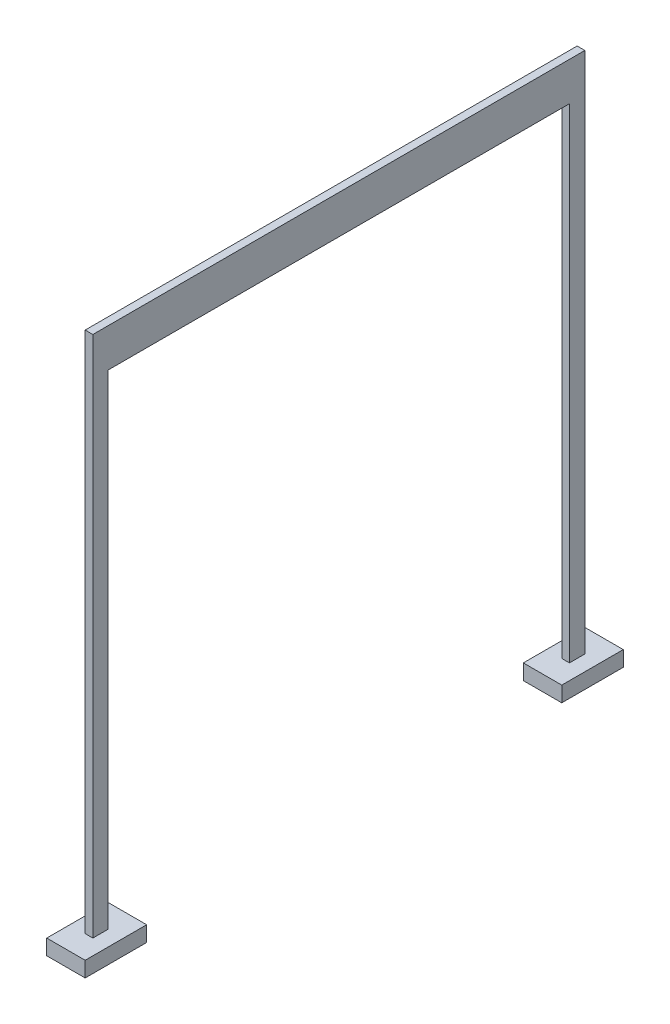
ISO-10303-21;
HEADER;
FILE_DESCRIPTION(('STEP AP214'),'2;1');
FILE_NAME('part.step','',(''),(''),'','','');
FILE_SCHEMA(('AUTOMOTIVE_DESIGN { 1 0 10303 214 1 1 1 1 }'));
ENDSEC;
DATA;
#1=APPLICATION_CONTEXT('core data for automotive mechanical design processes');
#2=APPLICATION_PROTOCOL_DEFINITION('international standard','automotive_design',2000,#1);
#3=PRODUCT_CONTEXT('',#1,'mechanical');
#4=PRODUCT('Part','Part','',(#3));
#5=PRODUCT_RELATED_PRODUCT_CATEGORY('part','',(#4));
#6=PRODUCT_DEFINITION_FORMATION('','',#4);
#7=PRODUCT_DEFINITION_CONTEXT('part definition',#1,'design');
#8=PRODUCT_DEFINITION('design','',#6,#7);
#9=PRODUCT_DEFINITION_SHAPE('','',#8);
#10=(LENGTH_UNIT() NAMED_UNIT(*) SI_UNIT(.MILLI.,.METRE.));
#11=(NAMED_UNIT(*) PLANE_ANGLE_UNIT() SI_UNIT($,.RADIAN.));
#12=(NAMED_UNIT(*) SI_UNIT($,.STERADIAN.) SOLID_ANGLE_UNIT());
#13=UNCERTAINTY_MEASURE_WITH_UNIT(LENGTH_MEASURE(1.E-05),#10,'distance_accuracy_value','');
#14=(GEOMETRIC_REPRESENTATION_CONTEXT(3) GLOBAL_UNCERTAINTY_ASSIGNED_CONTEXT((#13)) GLOBAL_UNIT_ASSIGNED_CONTEXT((#10,
#11,#12)) REPRESENTATION_CONTEXT('',''));
#15=CARTESIAN_POINT('',(0.,0.,0.));
#16=DIRECTION('',(0.,0.,1.));
#17=DIRECTION('',(1.,0.,0.));
#18=AXIS2_PLACEMENT_3D('',#15,#16,#17);
#19=CARTESIAN_POINT('',(5.,0.,0.));
#20=DIRECTION('',(1.,0.,0.));
#21=DIRECTION('',(0.,0.,-1.));
#22=AXIS2_PLACEMENT_3D('',#19,#20,#21);
#23=PLANE('',#22);
#24=DIRECTION('',(0.,1.,0.));
#25=VECTOR('',#24,1.);
#26=CARTESIAN_POINT('',(5.,0.,-300.));
#27=LINE('',#26,#25);
#28=CARTESIAN_POINT('',(5.,-654.999999999999,-300.));
#29=VERTEX_POINT('',#28);
#30=CARTESIAN_POINT('',(5.,-25.,-300.));
#31=VERTEX_POINT('',#30);
#32=EDGE_CURVE('E109',#29,#31,#27,.T.);
#33=ORIENTED_EDGE('',*,*,#32,.F.);
#34=DIRECTION('',(0.,0.,-1.));
#35=VECTOR('',#34,1.);
#36=CARTESIAN_POINT('',(5.,-654.999999999999,0.));
#37=LINE('',#36,#35);
#38=CARTESIAN_POINT('',(5.,-654.999999999999,-320.));
#39=VERTEX_POINT('',#38);
#40=EDGE_CURVE('E104',#29,#39,#37,.T.);
#41=ORIENTED_EDGE('',*,*,#40,.T.);
#42=DIRECTION('',(0.,-1.,0.));
#43=VECTOR('',#42,1.);
#44=CARTESIAN_POINT('',(5.,0.,-320.));
#45=LINE('',#44,#43);
#46=CARTESIAN_POINT('',(5.,25.,-320.));
#47=VERTEX_POINT('',#46);
#48=EDGE_CURVE('E107',#47,#39,#45,.T.);
#49=ORIENTED_EDGE('',*,*,#48,.F.);
#50=DIRECTION('',(0.,0.,1.));
#51=VECTOR('',#50,1.);
#52=CARTESIAN_POINT('',(5.,25.0000000000001,0.));
#53=LINE('',#52,#51);
#54=CARTESIAN_POINT('',(5.,25.,320.));
#55=VERTEX_POINT('',#54);
#56=EDGE_CURVE('E58',#47,#55,#53,.T.);
#57=ORIENTED_EDGE('',*,*,#56,.T.);
#58=DIRECTION('',(0.,-1.,0.));
#59=VECTOR('',#58,1.);
#60=CARTESIAN_POINT('',(5.,0.,320.));
#61=LINE('',#60,#59);
#62=CARTESIAN_POINT('',(5.,-655.,320.));
#63=VERTEX_POINT('',#62);
#64=EDGE_CURVE('E148',#55,#63,#61,.T.);
#65=ORIENTED_EDGE('',*,*,#64,.T.);
#66=DIRECTION('',(0.,0.,1.));
#67=VECTOR('',#66,1.);
#68=CARTESIAN_POINT('',(5.,-655.,0.));
#69=LINE('',#68,#67);
#70=CARTESIAN_POINT('',(5.,-655.,300.));
#71=VERTEX_POINT('',#70);
#72=EDGE_CURVE('E90',#71,#63,#69,.T.);
#73=ORIENTED_EDGE('',*,*,#72,.F.);
#74=DIRECTION('',(0.,-1.,0.));
#75=VECTOR('',#74,1.);
#76=CARTESIAN_POINT('',(5.,0.,300.));
#77=LINE('',#76,#75);
#78=CARTESIAN_POINT('',(5.,-25.,300.));
#79=VERTEX_POINT('',#78);
#80=EDGE_CURVE('E294',#79,#71,#77,.T.);
#81=ORIENTED_EDGE('',*,*,#80,.F.);
#82=DIRECTION('',(0.,0.,-1.));
#83=VECTOR('',#82,1.);
#84=CARTESIAN_POINT('',(5.,-25.,0.));
#85=LINE('',#84,#83);
#86=EDGE_CURVE('E129',#79,#31,#85,.T.);
#87=ORIENTED_EDGE('',*,*,#86,.T.);
#88=EDGE_LOOP('',(#33,#41,#49,#57,#65,#73,#81,#87));
#89=FACE_BOUND('',#88,.T.);
#90=ADVANCED_FACE('F41',(#89),#23,.T.);
#91=CARTESIAN_POINT('',(-5.,0.,0.));
#92=DIRECTION('',(1.,0.,0.));
#93=DIRECTION('',(0.,0.,-1.));
#94=AXIS2_PLACEMENT_3D('',#91,#92,#93);
#95=PLANE('',#94);
#96=DIRECTION('',(0.,0.,-1.));
#97=VECTOR('',#96,1.);
#98=CARTESIAN_POINT('',(-5.,-654.999999999999,0.));
#99=LINE('',#98,#97);
#100=CARTESIAN_POINT('',(-5.,-654.999999999999,-300.));
#101=VERTEX_POINT('',#100);
#102=CARTESIAN_POINT('',(-5.,-654.999999999999,-320.));
#103=VERTEX_POINT('',#102);
#104=EDGE_CURVE('E11',#101,#103,#99,.T.);
#105=ORIENTED_EDGE('',*,*,#104,.F.);
#106=DIRECTION('',(0.,1.,0.));
#107=VECTOR('',#106,1.);
#108=CARTESIAN_POINT('',(-5.,0.,-300.));
#109=LINE('',#108,#107);
#110=CARTESIAN_POINT('',(-5.,-25.,-300.));
#111=VERTEX_POINT('',#110);
#112=EDGE_CURVE('E142',#101,#111,#109,.T.);
#113=ORIENTED_EDGE('',*,*,#112,.T.);
#114=DIRECTION('',(0.,0.,-1.));
#115=VECTOR('',#114,1.);
#116=CARTESIAN_POINT('',(-5.,-25.,0.));
#117=LINE('',#116,#115);
#118=CARTESIAN_POINT('',(-5.,-25.,300.));
#119=VERTEX_POINT('',#118);
#120=EDGE_CURVE('E139',#119,#111,#117,.T.);
#121=ORIENTED_EDGE('',*,*,#120,.F.);
#122=DIRECTION('',(0.,-1.,0.));
#123=VECTOR('',#122,1.);
#124=CARTESIAN_POINT('',(-5.,0.,300.));
#125=LINE('',#124,#123);
#126=CARTESIAN_POINT('',(-5.,-655.,300.));
#127=VERTEX_POINT('',#126);
#128=EDGE_CURVE('E136',#119,#127,#125,.T.);
#129=ORIENTED_EDGE('',*,*,#128,.T.);
#130=DIRECTION('',(0.,0.,1.));
#131=VECTOR('',#130,1.);
#132=CARTESIAN_POINT('',(-5.,-655.,0.));
#133=LINE('',#132,#131);
#134=CARTESIAN_POINT('',(-5.,-655.,320.));
#135=VERTEX_POINT('',#134);
#136=EDGE_CURVE('E50',#127,#135,#133,.T.);
#137=ORIENTED_EDGE('',*,*,#136,.T.);
#138=DIRECTION('',(0.,-1.,0.));
#139=VECTOR('',#138,1.);
#140=CARTESIAN_POINT('',(-5.,0.,320.));
#141=LINE('',#140,#139);
#142=CARTESIAN_POINT('',(-5.,25.,320.));
#143=VERTEX_POINT('',#142);
#144=EDGE_CURVE('E133',#143,#135,#141,.T.);
#145=ORIENTED_EDGE('',*,*,#144,.F.);
#146=DIRECTION('',(0.,0.,1.));
#147=VECTOR('',#146,1.);
#148=CARTESIAN_POINT('',(-5.,25.0000000000001,0.));
#149=LINE('',#148,#147);
#150=CARTESIAN_POINT('',(-5.,25.,-320.));
#151=VERTEX_POINT('',#150);
#152=EDGE_CURVE('E81',#151,#143,#149,.T.);
#153=ORIENTED_EDGE('',*,*,#152,.F.);
#154=DIRECTION('',(0.,-1.,0.));
#155=VECTOR('',#154,1.);
#156=CARTESIAN_POINT('',(-5.,0.,-320.));
#157=LINE('',#156,#155);
#158=EDGE_CURVE('E145',#151,#103,#157,.T.);
#159=ORIENTED_EDGE('',*,*,#158,.T.);
#160=EDGE_LOOP('',(#105,#113,#121,#129,#137,#145,#153,#159));
#161=FACE_BOUND('',#160,.T.);
#162=ADVANCED_FACE('F188',(#161),#95,.F.);
#163=CARTESIAN_POINT('',(5.,0.,320.));
#164=DIRECTION('',(0.,0.,-1.));
#165=DIRECTION('',(0.,1.,0.));
#166=AXIS2_PLACEMENT_3D('',#163,#164,#165);
#167=PLANE('',#166);
#168=ORIENTED_EDGE('',*,*,#144,.T.);
#169=DIRECTION('',(-1.,0.,0.));
#170=VECTOR('',#169,1.);
#171=CARTESIAN_POINT('',(5.,-655.,320.));
#172=LINE('',#171,#170);
#173=EDGE_CURVE('E182',#63,#135,#172,.T.);
#174=ORIENTED_EDGE('',*,*,#173,.F.);
#175=ORIENTED_EDGE('',*,*,#64,.F.);
#176=DIRECTION('',(-1.,0.,0.));
#177=VECTOR('',#176,1.);
#178=CARTESIAN_POINT('',(5.,25.,320.));
#179=LINE('',#178,#177);
#180=EDGE_CURVE('E127',#55,#143,#179,.T.);
#181=ORIENTED_EDGE('',*,*,#180,.T.);
#182=EDGE_LOOP('',(#168,#174,#175,#181));
#183=FACE_BOUND('',#182,.T.);
#184=ADVANCED_FACE('F43',(#183),#167,.F.);
#185=CARTESIAN_POINT('',(5.,-9.71445146547016E-13,350.000000000002));
#186=DIRECTION('',(0.,0.,-1.));
#187=DIRECTION('',(0.,1.,0.));
#188=AXIS2_PLACEMENT_3D('',#185,#186,#187);
#189=PLANE('',#188);
#190=DIRECTION('',(-1.,0.,0.));
#191=VECTOR('',#190,1.);
#192=CARTESIAN_POINT('',(5.,-655.,350.));
#193=LINE('',#192,#191);
#194=CARTESIAN_POINT('',(25.,-655.,350.));
#195=VERTEX_POINT('',#194);
#196=CARTESIAN_POINT('',(-25.,-655.,350.));
#197=VERTEX_POINT('',#196);
#198=EDGE_CURVE('E179',#195,#197,#193,.T.);
#199=ORIENTED_EDGE('',*,*,#198,.T.);
#200=DIRECTION('',(0.,-1.,0.));
#201=VECTOR('',#200,1.);
#202=CARTESIAN_POINT('',(-25.,-9.71445146547016E-13,350.000000000002));
#203=LINE('',#202,#201);
#204=CARTESIAN_POINT('',(-25.,-675.,350.));
#205=VERTEX_POINT('',#204);
#206=EDGE_CURVE('E112',#197,#205,#203,.T.);
#207=ORIENTED_EDGE('',*,*,#206,.T.);
#208=DIRECTION('',(-1.,0.,0.));
#209=VECTOR('',#208,1.);
#210=CARTESIAN_POINT('',(5.,-675.,350.));
#211=LINE('',#210,#209);
#212=CARTESIAN_POINT('',(25.,-675.,350.));
#213=VERTEX_POINT('',#212);
#214=EDGE_CURVE('E176',#213,#205,#211,.T.);
#215=ORIENTED_EDGE('',*,*,#214,.F.);
#216=DIRECTION('',(0.,-1.,0.));
#217=VECTOR('',#216,1.);
#218=CARTESIAN_POINT('',(25.,-9.71445146547016E-13,350.000000000002));
#219=LINE('',#218,#217);
#220=EDGE_CURVE('E269',#195,#213,#219,.T.);
#221=ORIENTED_EDGE('',*,*,#220,.F.);
#222=EDGE_LOOP('',(#199,#207,#215,#221));
#223=FACE_BOUND('',#222,.T.);
#224=ADVANCED_FACE('F329',(#223),#189,.F.);
#225=CARTESIAN_POINT('',(5.,-674.999999999998,-3.74700270810989E-12));
#226=DIRECTION('',(0.,-1.,0.));
#227=DIRECTION('',(0.,0.,-1.));
#228=AXIS2_PLACEMENT_3D('',#225,#226,#227);
#229=PLANE('',#228);
#230=ORIENTED_EDGE('',*,*,#214,.T.);
#231=DIRECTION('',(0.,0.,-1.));
#232=VECTOR('',#231,1.);
#233=CARTESIAN_POINT('',(-25.,-675.,0.));
#234=LINE('',#233,#232);
#235=CARTESIAN_POINT('',(-25.,-675.,270.));
#236=VERTEX_POINT('',#235);
#237=EDGE_CURVE('E284',#205,#236,#234,.T.);
#238=ORIENTED_EDGE('',*,*,#237,.T.);
#239=DIRECTION('',(-1.,0.,0.));
#240=VECTOR('',#239,1.);
#241=CARTESIAN_POINT('',(5.,-675.,270.));
#242=LINE('',#241,#240);
#243=CARTESIAN_POINT('',(25.,-675.,270.));
#244=VERTEX_POINT('',#243);
#245=EDGE_CURVE('E173',#244,#236,#242,.T.);
#246=ORIENTED_EDGE('',*,*,#245,.F.);
#247=DIRECTION('',(0.,0.,-1.));
#248=VECTOR('',#247,1.);
#249=CARTESIAN_POINT('',(25.,-675.,0.));
#250=LINE('',#249,#248);
#251=EDGE_CURVE('E272',#213,#244,#250,.T.);
#252=ORIENTED_EDGE('',*,*,#251,.F.);
#253=EDGE_LOOP('',(#230,#238,#246,#252));
#254=FACE_BOUND('',#253,.T.);
#255=ADVANCED_FACE('F340',(#254),#229,.T.);
#256=CARTESIAN_POINT('',(5.,0.,270.));
#257=DIRECTION('',(0.,0.,-1.));
#258=DIRECTION('',(-1.,0.,0.));
#259=AXIS2_PLACEMENT_3D('',#256,#257,#258);
#260=PLANE('',#259);
#261=ORIENTED_EDGE('',*,*,#245,.T.);
#262=DIRECTION('',(0.,-1.,0.));
#263=VECTOR('',#262,1.);
#264=CARTESIAN_POINT('',(-25.,0.,270.));
#265=LINE('',#264,#263);
#266=CARTESIAN_POINT('',(-25.,-655.,270.));
#267=VERTEX_POINT('',#266);
#268=EDGE_CURVE('E287',#267,#236,#265,.T.);
#269=ORIENTED_EDGE('',*,*,#268,.F.);
#270=DIRECTION('',(-1.,0.,0.));
#271=VECTOR('',#270,1.);
#272=CARTESIAN_POINT('',(5.,-655.,270.));
#273=LINE('',#272,#271);
#274=CARTESIAN_POINT('',(25.,-655.,270.));
#275=VERTEX_POINT('',#274);
#276=EDGE_CURVE('E170',#275,#267,#273,.T.);
#277=ORIENTED_EDGE('',*,*,#276,.F.);
#278=DIRECTION('',(0.,-1.,0.));
#279=VECTOR('',#278,1.);
#280=CARTESIAN_POINT('',(25.,0.,270.));
#281=LINE('',#280,#279);
#282=EDGE_CURVE('E276',#275,#244,#281,.T.);
#283=ORIENTED_EDGE('',*,*,#282,.T.);
#284=EDGE_LOOP('',(#261,#269,#277,#283));
#285=FACE_BOUND('',#284,.T.);
#286=ADVANCED_FACE('F337',(#285),#260,.T.);
#287=CARTESIAN_POINT('',(5.,-655.,0.));
#288=DIRECTION('',(0.,1.,0.));
#289=DIRECTION('',(0.,0.,1.));
#290=AXIS2_PLACEMENT_3D('',#287,#288,#289);
#291=PLANE('',#290);
#292=DIRECTION('',(0.,0.,-1.));
#293=VECTOR('',#292,1.);
#294=CARTESIAN_POINT('',(25.,-655.,0.));
#295=LINE('',#294,#293);
#296=EDGE_CURVE('E279',#195,#275,#295,.T.);
#297=ORIENTED_EDGE('',*,*,#296,.T.);
#298=ORIENTED_EDGE('',*,*,#276,.T.);
#299=DIRECTION('',(0.,0.,-1.));
#300=VECTOR('',#299,1.);
#301=CARTESIAN_POINT('',(-25.,-655.,0.));
#302=LINE('',#301,#300);
#303=EDGE_CURVE('E273',#197,#267,#302,.T.);
#304=ORIENTED_EDGE('',*,*,#303,.F.);
#305=ORIENTED_EDGE('',*,*,#198,.F.);
#306=EDGE_LOOP('',(#297,#298,#304,#305));
#307=FACE_BOUND('',#306,.T.);
#308=DIRECTION('',(-1.,0.,0.));
#309=VECTOR('',#308,1.);
#310=CARTESIAN_POINT('',(5.,-655.,300.));
#311=LINE('',#310,#309);
#312=EDGE_CURVE('E168',#71,#127,#311,.T.);
#313=ORIENTED_EDGE('',*,*,#312,.F.);
#314=ORIENTED_EDGE('',*,*,#72,.T.);
#315=ORIENTED_EDGE('',*,*,#173,.T.);
#316=ORIENTED_EDGE('',*,*,#136,.F.);
#317=EDGE_LOOP('',(#313,#314,#315,#316));
#318=FACE_BOUND('',#317,.T.);
#319=ADVANCED_FACE('F192',(#307,#318),#291,.T.);
#320=CARTESIAN_POINT('',(5.,0.,300.));
#321=DIRECTION('',(0.,0.,-1.));
#322=DIRECTION('',(0.,1.,0.));
#323=AXIS2_PLACEMENT_3D('',#320,#321,#322);
#324=PLANE('',#323);
#325=ORIENTED_EDGE('',*,*,#128,.F.);
#326=DIRECTION('',(-1.,0.,0.));
#327=VECTOR('',#326,1.);
#328=CARTESIAN_POINT('',(5.,-25.,300.));
#329=LINE('',#328,#327);
#330=EDGE_CURVE('E166',#79,#119,#329,.T.);
#331=ORIENTED_EDGE('',*,*,#330,.F.);
#332=ORIENTED_EDGE('',*,*,#80,.T.);
#333=ORIENTED_EDGE('',*,*,#312,.T.);
#334=EDGE_LOOP('',(#325,#331,#332,#333));
#335=FACE_BOUND('',#334,.T.);
#336=ADVANCED_FACE('F351',(#335),#324,.T.);
#337=CARTESIAN_POINT('',(5.,-25.,0.));
#338=DIRECTION('',(0.,1.,0.));
#339=DIRECTION('',(0.,0.,1.));
#340=AXIS2_PLACEMENT_3D('',#337,#338,#339);
#341=PLANE('',#340);
#342=ORIENTED_EDGE('',*,*,#120,.T.);
#343=DIRECTION('',(-1.,0.,0.));
#344=VECTOR('',#343,1.);
#345=CARTESIAN_POINT('',(5.,-25.,-300.));
#346=LINE('',#345,#344);
#347=EDGE_CURVE('E164',#31,#111,#346,.T.);
#348=ORIENTED_EDGE('',*,*,#347,.F.);
#349=ORIENTED_EDGE('',*,*,#86,.F.);
#350=ORIENTED_EDGE('',*,*,#330,.T.);
#351=EDGE_LOOP('',(#342,#348,#349,#350));
#352=FACE_BOUND('',#351,.T.);
#353=ADVANCED_FACE('F299',(#352),#341,.F.);
#354=CARTESIAN_POINT('',(5.,0.,-300.));
#355=DIRECTION('',(0.,0.,1.));
#356=DIRECTION('',(1.,0.,0.));
#357=AXIS2_PLACEMENT_3D('',#354,#355,#356);
#358=PLANE('',#357);
#359=ORIENTED_EDGE('',*,*,#112,.F.);
#360=DIRECTION('',(-1.,0.,0.));
#361=VECTOR('',#360,1.);
#362=CARTESIAN_POINT('',(5.,-654.999999999999,-300.));
#363=LINE('',#362,#361);
#364=EDGE_CURVE('E162',#29,#101,#363,.T.);
#365=ORIENTED_EDGE('',*,*,#364,.F.);
#366=ORIENTED_EDGE('',*,*,#32,.T.);
#367=ORIENTED_EDGE('',*,*,#347,.T.);
#368=EDGE_LOOP('',(#359,#365,#366,#367));
#369=FACE_BOUND('',#368,.T.);
#370=ADVANCED_FACE('F302',(#369),#358,.T.);
#371=CARTESIAN_POINT('',(5.,0.,-270.));
#372=DIRECTION('',(0.,0.,-1.));
#373=DIRECTION('',(-1.,0.,0.));
#374=AXIS2_PLACEMENT_3D('',#371,#372,#373);
#375=PLANE('',#374);
#376=DIRECTION('',(-1.,0.,0.));
#377=VECTOR('',#376,1.);
#378=CARTESIAN_POINT('',(5.,-654.999999999999,-270.));
#379=LINE('',#378,#377);
#380=CARTESIAN_POINT('',(25.,-654.999999999999,-270.));
#381=VERTEX_POINT('',#380);
#382=CARTESIAN_POINT('',(-25.,-654.999999999999,-270.));
#383=VERTEX_POINT('',#382);
#384=EDGE_CURVE('E159',#381,#383,#379,.T.);
#385=ORIENTED_EDGE('',*,*,#384,.T.);
#386=DIRECTION('',(0.,-1.,0.));
#387=VECTOR('',#386,1.);
#388=CARTESIAN_POINT('',(-25.,0.,-270.));
#389=LINE('',#388,#387);
#390=CARTESIAN_POINT('',(-25.,-675.,-270.));
#391=VERTEX_POINT('',#390);
#392=EDGE_CURVE('E244',#383,#391,#389,.T.);
#393=ORIENTED_EDGE('',*,*,#392,.T.);
#394=DIRECTION('',(-1.,0.,0.));
#395=VECTOR('',#394,1.);
#396=CARTESIAN_POINT('',(5.,-675.,-270.));
#397=LINE('',#396,#395);
#398=CARTESIAN_POINT('',(25.,-675.,-270.));
#399=VERTEX_POINT('',#398);
#400=EDGE_CURVE('E156',#399,#391,#397,.T.);
#401=ORIENTED_EDGE('',*,*,#400,.F.);
#402=DIRECTION('',(0.,-1.,0.));
#403=VECTOR('',#402,1.);
#404=CARTESIAN_POINT('',(25.,0.,-270.));
#405=LINE('',#404,#403);
#406=EDGE_CURVE('E113',#381,#399,#405,.T.);
#407=ORIENTED_EDGE('',*,*,#406,.F.);
#408=EDGE_LOOP('',(#385,#393,#401,#407));
#409=FACE_BOUND('',#408,.T.);
#410=ADVANCED_FACE('F359',(#409),#375,.F.);
#411=CARTESIAN_POINT('',(5.,-674.999999999998,3.74700270810989E-12));
#412=DIRECTION('',(0.,1.,0.));
#413=DIRECTION('',(0.,0.,1.));
#414=AXIS2_PLACEMENT_3D('',#411,#412,#413);
#415=PLANE('',#414);
#416=ORIENTED_EDGE('',*,*,#400,.T.);
#417=DIRECTION('',(0.,0.,1.));
#418=VECTOR('',#417,1.);
#419=CARTESIAN_POINT('',(-25.,-675.,0.));
#420=LINE('',#419,#418);
#421=CARTESIAN_POINT('',(-25.,-675.,-350.));
#422=VERTEX_POINT('',#421);
#423=EDGE_CURVE('E258',#422,#391,#420,.T.);
#424=ORIENTED_EDGE('',*,*,#423,.F.);
#425=DIRECTION('',(-1.,0.,0.));
#426=VECTOR('',#425,1.);
#427=CARTESIAN_POINT('',(5.,-675.,-350.));
#428=LINE('',#427,#426);
#429=CARTESIAN_POINT('',(25.,-675.,-350.));
#430=VERTEX_POINT('',#429);
#431=EDGE_CURVE('E153',#430,#422,#428,.T.);
#432=ORIENTED_EDGE('',*,*,#431,.F.);
#433=DIRECTION('',(0.,0.,1.));
#434=VECTOR('',#433,1.);
#435=CARTESIAN_POINT('',(25.,-675.,0.));
#436=LINE('',#435,#434);
#437=EDGE_CURVE('E233',#430,#399,#436,.T.);
#438=ORIENTED_EDGE('',*,*,#437,.T.);
#439=EDGE_LOOP('',(#416,#424,#432,#438));
#440=FACE_BOUND('',#439,.T.);
#441=ADVANCED_FACE('F362',(#440),#415,.F.);
#442=CARTESIAN_POINT('',(5.,-9.71445146547016E-13,-350.000000000002));
#443=DIRECTION('',(0.,0.,-1.));
#444=DIRECTION('',(0.,1.,0.));
#445=AXIS2_PLACEMENT_3D('',#442,#443,#444);
#446=PLANE('',#445);
#447=ORIENTED_EDGE('',*,*,#431,.T.);
#448=DIRECTION('',(0.,-1.,0.));
#449=VECTOR('',#448,1.);
#450=CARTESIAN_POINT('',(-25.,-9.71445146547016E-13,-350.000000000002));
#451=LINE('',#450,#449);
#452=CARTESIAN_POINT('',(-25.,-654.999999999999,-350.));
#453=VERTEX_POINT('',#452);
#454=EDGE_CURVE('E261',#453,#422,#451,.T.);
#455=ORIENTED_EDGE('',*,*,#454,.F.);
#456=DIRECTION('',(-1.,0.,0.));
#457=VECTOR('',#456,1.);
#458=CARTESIAN_POINT('',(5.,-654.999999999999,-350.));
#459=LINE('',#458,#457);
#460=CARTESIAN_POINT('',(25.,-654.999999999999,-350.));
#461=VERTEX_POINT('',#460);
#462=EDGE_CURVE('E123',#461,#453,#459,.T.);
#463=ORIENTED_EDGE('',*,*,#462,.F.);
#464=DIRECTION('',(0.,-1.,0.));
#465=VECTOR('',#464,1.);
#466=CARTESIAN_POINT('',(25.,-9.71445146547016E-13,-350.000000000002));
#467=LINE('',#466,#465);
#468=EDGE_CURVE('E237',#461,#430,#467,.T.);
#469=ORIENTED_EDGE('',*,*,#468,.T.);
#470=EDGE_LOOP('',(#447,#455,#463,#469));
#471=FACE_BOUND('',#470,.T.);
#472=ADVANCED_FACE('F248',(#471),#446,.T.);
#473=CARTESIAN_POINT('',(5.,-654.999999999999,0.));
#474=DIRECTION('',(0.,-1.,0.));
#475=DIRECTION('',(0.,0.,-1.));
#476=AXIS2_PLACEMENT_3D('',#473,#474,#475);
#477=PLANE('',#476);
#478=ORIENTED_EDGE('',*,*,#384,.F.);
#479=DIRECTION('',(0.,0.,1.));
#480=VECTOR('',#479,1.);
#481=CARTESIAN_POINT('',(25.,-654.999999999999,0.));
#482=LINE('',#481,#480);
#483=EDGE_CURVE('E253',#461,#381,#482,.T.);
#484=ORIENTED_EDGE('',*,*,#483,.F.);
#485=ORIENTED_EDGE('',*,*,#462,.T.);
#486=DIRECTION('',(0.,0.,1.));
#487=VECTOR('',#486,1.);
#488=CARTESIAN_POINT('',(-25.,-654.999999999999,0.));
#489=LINE('',#488,#487);
#490=EDGE_CURVE('E264',#453,#383,#489,.T.);
#491=ORIENTED_EDGE('',*,*,#490,.T.);
#492=EDGE_LOOP('',(#478,#484,#485,#491));
#493=FACE_BOUND('',#492,.T.);
#494=ORIENTED_EDGE('',*,*,#40,.F.);
#495=ORIENTED_EDGE('',*,*,#364,.T.);
#496=ORIENTED_EDGE('',*,*,#104,.T.);
#497=DIRECTION('',(-1.,0.,0.));
#498=VECTOR('',#497,1.);
#499=CARTESIAN_POINT('',(5.,-654.999999999999,-320.));
#500=LINE('',#499,#498);
#501=EDGE_CURVE('E116',#39,#103,#500,.T.);
#502=ORIENTED_EDGE('',*,*,#501,.F.);
#503=EDGE_LOOP('',(#494,#495,#496,#502));
#504=FACE_BOUND('',#503,.T.);
#505=ADVANCED_FACE('F117',(#493,#504),#477,.F.);
#506=CARTESIAN_POINT('',(5.,0.,-320.));
#507=DIRECTION('',(0.,0.,-1.));
#508=DIRECTION('',(0.,1.,0.));
#509=AXIS2_PLACEMENT_3D('',#506,#507,#508);
#510=PLANE('',#509);
#511=ORIENTED_EDGE('',*,*,#158,.F.);
#512=DIRECTION('',(-1.,0.,0.));
#513=VECTOR('',#512,1.);
#514=CARTESIAN_POINT('',(5.,25.,-320.));
#515=LINE('',#514,#513);
#516=EDGE_CURVE('E78',#47,#151,#515,.T.);
#517=ORIENTED_EDGE('',*,*,#516,.F.);
#518=ORIENTED_EDGE('',*,*,#48,.T.);
#519=ORIENTED_EDGE('',*,*,#501,.T.);
#520=EDGE_LOOP('',(#511,#517,#518,#519));
#521=FACE_BOUND('',#520,.T.);
#522=ADVANCED_FACE('F125',(#521),#510,.T.);
#523=CARTESIAN_POINT('',(5.,25.0000000000001,0.));
#524=DIRECTION('',(0.,-1.,0.));
#525=DIRECTION('',(0.,0.,-1.));
#526=AXIS2_PLACEMENT_3D('',#523,#524,#525);
#527=PLANE('',#526);
#528=ORIENTED_EDGE('',*,*,#152,.T.);
#529=ORIENTED_EDGE('',*,*,#180,.F.);
#530=ORIENTED_EDGE('',*,*,#56,.F.);
#531=ORIENTED_EDGE('',*,*,#516,.T.);
#532=EDGE_LOOP('',(#528,#529,#530,#531));
#533=FACE_BOUND('',#532,.T.);
#534=ADVANCED_FACE('F197',(#533),#527,.F.);
#535=CARTESIAN_POINT('',(-25.,0.,0.));
#536=DIRECTION('',(1.,0.,0.));
#537=DIRECTION('',(0.,0.,-1.));
#538=AXIS2_PLACEMENT_3D('',#535,#536,#537);
#539=PLANE('',#538);
#540=ORIENTED_EDGE('',*,*,#206,.F.);
#541=ORIENTED_EDGE('',*,*,#303,.T.);
#542=ORIENTED_EDGE('',*,*,#268,.T.);
#543=ORIENTED_EDGE('',*,*,#237,.F.);
#544=EDGE_LOOP('',(#540,#541,#542,#543));
#545=FACE_BOUND('',#544,.T.);
#546=ADVANCED_FACE('F199',(#545),#539,.F.);
#547=CARTESIAN_POINT('',(25.,0.,0.));
#548=DIRECTION('',(1.,0.,0.));
#549=DIRECTION('',(0.,0.,-1.));
#550=AXIS2_PLACEMENT_3D('',#547,#548,#549);
#551=PLANE('',#550);
#552=ORIENTED_EDGE('',*,*,#220,.T.);
#553=ORIENTED_EDGE('',*,*,#251,.T.);
#554=ORIENTED_EDGE('',*,*,#282,.F.);
#555=ORIENTED_EDGE('',*,*,#296,.F.);
#556=EDGE_LOOP('',(#552,#553,#554,#555));
#557=FACE_BOUND('',#556,.T.);
#558=ADVANCED_FACE('F205',(#557),#551,.T.);
#559=CARTESIAN_POINT('',(-25.,0.,0.));
#560=DIRECTION('',(1.,0.,0.));
#561=DIRECTION('',(0.,0.,-1.));
#562=AXIS2_PLACEMENT_3D('',#559,#560,#561);
#563=PLANE('',#562);
#564=ORIENTED_EDGE('',*,*,#423,.T.);
#565=ORIENTED_EDGE('',*,*,#392,.F.);
#566=ORIENTED_EDGE('',*,*,#490,.F.);
#567=ORIENTED_EDGE('',*,*,#454,.T.);
#568=EDGE_LOOP('',(#564,#565,#566,#567));
#569=FACE_BOUND('',#568,.T.);
#570=ADVANCED_FACE('F218',(#569),#563,.F.);
#571=CARTESIAN_POINT('',(25.,0.,0.));
#572=DIRECTION('',(1.,0.,0.));
#573=DIRECTION('',(0.,0.,-1.));
#574=AXIS2_PLACEMENT_3D('',#571,#572,#573);
#575=PLANE('',#574);
#576=ORIENTED_EDGE('',*,*,#437,.F.);
#577=ORIENTED_EDGE('',*,*,#468,.F.);
#578=ORIENTED_EDGE('',*,*,#483,.T.);
#579=ORIENTED_EDGE('',*,*,#406,.T.);
#580=EDGE_LOOP('',(#576,#577,#578,#579));
#581=FACE_BOUND('',#580,.T.);
#582=ADVANCED_FACE('F222',(#581),#575,.T.);
#583=CLOSED_SHELL('',(#90,#162,#184,#224,#255,#286,#319,#336,#353,#370,#410,#441,#472,#505,#522,
#534,#546,#558,#570,#582));
#584=MANIFOLD_SOLID_BREP('B2',#583);
#585=ADVANCED_BREP_SHAPE_REPRESENTATION('',(#18,#584),#14);
#586=SHAPE_DEFINITION_REPRESENTATION(#9,#585);
ENDSEC;
END-ISO-10303-21;
